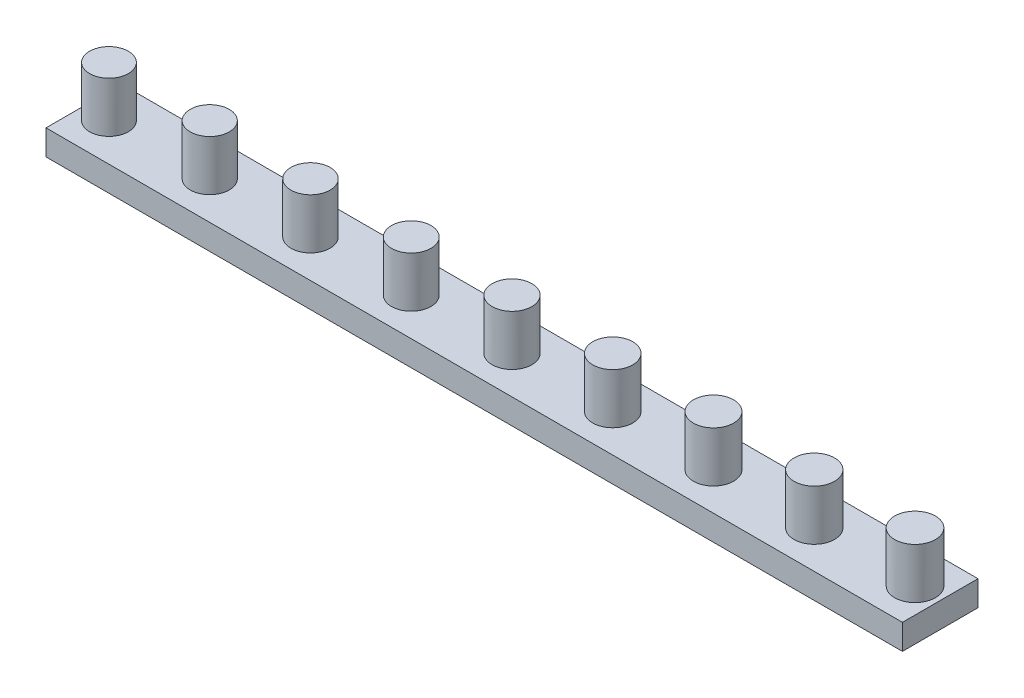
ISO-10303-21;
HEADER;
FILE_DESCRIPTION(('STEP AP214'),'2;1');
FILE_NAME('part.step','',(''),(''),'','','');
FILE_SCHEMA(('AUTOMOTIVE_DESIGN { 1 0 10303 214 1 1 1 1 }'));
ENDSEC;
DATA;
#1=APPLICATION_CONTEXT('core data for automotive mechanical design processes');
#2=APPLICATION_PROTOCOL_DEFINITION('international standard','automotive_design',2000,#1);
#3=PRODUCT_CONTEXT('',#1,'mechanical');
#4=PRODUCT('Part','Part','',(#3));
#5=PRODUCT_RELATED_PRODUCT_CATEGORY('part','',(#4));
#6=PRODUCT_DEFINITION_FORMATION('','',#4);
#7=PRODUCT_DEFINITION_CONTEXT('part definition',#1,'design');
#8=PRODUCT_DEFINITION('design','',#6,#7);
#9=PRODUCT_DEFINITION_SHAPE('','',#8);
#10=(LENGTH_UNIT() NAMED_UNIT(*) SI_UNIT(.MILLI.,.METRE.));
#11=(NAMED_UNIT(*) PLANE_ANGLE_UNIT() SI_UNIT($,.RADIAN.));
#12=(NAMED_UNIT(*) SI_UNIT($,.STERADIAN.) SOLID_ANGLE_UNIT());
#13=UNCERTAINTY_MEASURE_WITH_UNIT(LENGTH_MEASURE(1.E-05),#10,'distance_accuracy_value','');
#14=(GEOMETRIC_REPRESENTATION_CONTEXT(3) GLOBAL_UNCERTAINTY_ASSIGNED_CONTEXT((#13)) GLOBAL_UNIT_ASSIGNED_CONTEXT((#10,
#11,#12)) REPRESENTATION_CONTEXT('',''));
#15=CARTESIAN_POINT('',(0.,0.,0.));
#16=DIRECTION('',(0.,0.,1.));
#17=DIRECTION('',(1.,0.,0.));
#18=AXIS2_PLACEMENT_3D('',#15,#16,#17);
#19=CARTESIAN_POINT('',(85.,5.,7.5));
#20=DIRECTION('',(-1.,0.,0.));
#21=DIRECTION('',(0.,0.,1.));
#22=AXIS2_PLACEMENT_3D('',#19,#20,#21);
#23=PLANE('',#22);
#24=DIRECTION('',(0.,0.,-1.));
#25=VECTOR('',#24,1.);
#26=CARTESIAN_POINT('',(85.,0.,7.5));
#27=LINE('',#26,#25);
#28=CARTESIAN_POINT('',(85.,0.,7.5));
#29=VERTEX_POINT('',#28);
#30=CARTESIAN_POINT('',(85.,0.,-7.5));
#31=VERTEX_POINT('',#30);
#32=EDGE_CURVE('E100',#29,#31,#27,.T.);
#33=ORIENTED_EDGE('',*,*,#32,.T.);
#34=DIRECTION('',(0.,-1.,0.));
#35=VECTOR('',#34,1.);
#36=CARTESIAN_POINT('',(85.,5.,-7.5));
#37=LINE('',#36,#35);
#38=CARTESIAN_POINT('',(85.,5.,-7.5));
#39=VERTEX_POINT('',#38);
#40=EDGE_CURVE('E91',#39,#31,#37,.T.);
#41=ORIENTED_EDGE('',*,*,#40,.F.);
#42=DIRECTION('',(0.,0.,-1.));
#43=VECTOR('',#42,1.);
#44=CARTESIAN_POINT('',(85.,5.,7.5));
#45=LINE('',#44,#43);
#46=CARTESIAN_POINT('',(85.,5.,7.5));
#47=VERTEX_POINT('',#46);
#48=EDGE_CURVE('E85',#47,#39,#45,.T.);
#49=ORIENTED_EDGE('',*,*,#48,.F.);
#50=DIRECTION('',(0.,-1.,0.));
#51=VECTOR('',#50,1.);
#52=CARTESIAN_POINT('',(85.,5.,7.5));
#53=LINE('',#52,#51);
#54=EDGE_CURVE('E96',#47,#29,#53,.T.);
#55=ORIENTED_EDGE('',*,*,#54,.T.);
#56=EDGE_LOOP('',(#33,#41,#49,#55));
#57=FACE_BOUND('',#56,.T.);
#58=ADVANCED_FACE('F33',(#57),#23,.F.);
#59=CARTESIAN_POINT('',(-85.,5.,-7.5));
#60=DIRECTION('',(0.,0.,1.));
#61=DIRECTION('',(1.,0.,0.));
#62=AXIS2_PLACEMENT_3D('',#59,#60,#61);
#63=PLANE('',#62);
#64=DIRECTION('',(-1.,0.,0.));
#65=VECTOR('',#64,1.);
#66=CARTESIAN_POINT('',(-85.,0.,-7.5));
#67=LINE('',#66,#65);
#68=CARTESIAN_POINT('',(-85.,0.,-7.5));
#69=VERTEX_POINT('',#68);
#70=EDGE_CURVE('E90',#31,#69,#67,.T.);
#71=ORIENTED_EDGE('',*,*,#70,.T.);
#72=DIRECTION('',(0.,-1.,0.));
#73=VECTOR('',#72,1.);
#74=CARTESIAN_POINT('',(-85.,5.,-7.5));
#75=LINE('',#74,#73);
#76=CARTESIAN_POINT('',(-85.,5.,-7.5));
#77=VERTEX_POINT('',#76);
#78=EDGE_CURVE('E88',#77,#69,#75,.T.);
#79=ORIENTED_EDGE('',*,*,#78,.F.);
#80=DIRECTION('',(-1.,0.,0.));
#81=VECTOR('',#80,1.);
#82=CARTESIAN_POINT('',(-85.,5.,-7.5));
#83=LINE('',#82,#81);
#84=EDGE_CURVE('E80',#39,#77,#83,.T.);
#85=ORIENTED_EDGE('',*,*,#84,.F.);
#86=ORIENTED_EDGE('',*,*,#40,.T.);
#87=EDGE_LOOP('',(#71,#79,#85,#86));
#88=FACE_BOUND('',#87,.T.);
#89=ADVANCED_FACE('F89',(#88),#63,.F.);
#90=CARTESIAN_POINT('',(-85.,5.,7.5));
#91=DIRECTION('',(1.,0.,0.));
#92=DIRECTION('',(0.,0.,-1.));
#93=AXIS2_PLACEMENT_3D('',#90,#91,#92);
#94=PLANE('',#93);
#95=DIRECTION('',(0.,0.,1.));
#96=VECTOR('',#95,1.);
#97=CARTESIAN_POINT('',(-85.,0.,7.5));
#98=LINE('',#97,#96);
#99=CARTESIAN_POINT('',(-85.,0.,7.5));
#100=VERTEX_POINT('',#99);
#101=EDGE_CURVE('E66',#69,#100,#98,.T.);
#102=ORIENTED_EDGE('',*,*,#101,.T.);
#103=DIRECTION('',(0.,-1.,0.));
#104=VECTOR('',#103,1.);
#105=CARTESIAN_POINT('',(-85.,5.,7.5));
#106=LINE('',#105,#104);
#107=CARTESIAN_POINT('',(-85.,5.,7.5));
#108=VERTEX_POINT('',#107);
#109=EDGE_CURVE('E92',#108,#100,#106,.T.);
#110=ORIENTED_EDGE('',*,*,#109,.F.);
#111=DIRECTION('',(0.,0.,1.));
#112=VECTOR('',#111,1.);
#113=CARTESIAN_POINT('',(-85.,5.,7.5));
#114=LINE('',#113,#112);
#115=EDGE_CURVE('E83',#77,#108,#114,.T.);
#116=ORIENTED_EDGE('',*,*,#115,.F.);
#117=ORIENTED_EDGE('',*,*,#78,.T.);
#118=EDGE_LOOP('',(#102,#110,#116,#117));
#119=FACE_BOUND('',#118,.T.);
#120=ADVANCED_FACE('F94',(#119),#94,.F.);
#121=CARTESIAN_POINT('',(-85.,5.,7.5));
#122=DIRECTION('',(0.,0.,-1.));
#123=DIRECTION('',(-1.,0.,0.));
#124=AXIS2_PLACEMENT_3D('',#121,#122,#123);
#125=PLANE('',#124);
#126=DIRECTION('',(1.,0.,0.));
#127=VECTOR('',#126,1.);
#128=CARTESIAN_POINT('',(-85.,0.,7.5));
#129=LINE('',#128,#127);
#130=EDGE_CURVE('E72',#100,#29,#129,.T.);
#131=ORIENTED_EDGE('',*,*,#130,.T.);
#132=ORIENTED_EDGE('',*,*,#54,.F.);
#133=DIRECTION('',(1.,0.,0.));
#134=VECTOR('',#133,1.);
#135=CARTESIAN_POINT('',(-85.,5.,7.5));
#136=LINE('',#135,#134);
#137=EDGE_CURVE('E49',#108,#47,#136,.T.);
#138=ORIENTED_EDGE('',*,*,#137,.F.);
#139=ORIENTED_EDGE('',*,*,#109,.T.);
#140=EDGE_LOOP('',(#131,#132,#138,#139));
#141=FACE_BOUND('',#140,.T.);
#142=ADVANCED_FACE('F138',(#141),#125,.F.);
#143=CARTESIAN_POINT('',(0.,5.,0.));
#144=DIRECTION('',(0.,-1.,0.));
#145=DIRECTION('',(0.,0.,-1.));
#146=AXIS2_PLACEMENT_3D('',#143,#144,#145);
#147=PLANE('',#146);
#148=CARTESIAN_POINT('',(80.,5.,0.));
#149=DIRECTION('',(0.,-1.,0.));
#150=DIRECTION('',(0.,0.,-1.));
#151=AXIS2_PLACEMENT_3D('',#148,#149,#150);
#152=CIRCLE('',#151,4.05);
#153=CARTESIAN_POINT('',(80.,5.,-4.05));
#154=VERTEX_POINT('',#153);
#155=EDGE_CURVE('E11',#154,#154,#152,.F.);
#156=ORIENTED_EDGE('',*,*,#155,.F.);
#157=EDGE_LOOP('',(#156));
#158=FACE_BOUND('',#157,.T.);
#159=CARTESIAN_POINT('',(60.,5.,0.));
#160=DIRECTION('',(0.,-1.,0.));
#161=DIRECTION('',(0.,0.,-1.));
#162=AXIS2_PLACEMENT_3D('',#159,#160,#161);
#163=CIRCLE('',#162,4.025);
#164=CARTESIAN_POINT('',(60.,5.,-4.025));
#165=VERTEX_POINT('',#164);
#166=EDGE_CURVE('E41',#165,#165,#163,.F.);
#167=ORIENTED_EDGE('',*,*,#166,.F.);
#168=EDGE_LOOP('',(#167));
#169=FACE_BOUND('',#168,.T.);
#170=CARTESIAN_POINT('',(40.,5.,0.));
#171=DIRECTION('',(0.,-1.,0.));
#172=DIRECTION('',(0.,0.,-1.));
#173=AXIS2_PLACEMENT_3D('',#170,#171,#172);
#174=CIRCLE('',#173,4.);
#175=CARTESIAN_POINT('',(40.,5.,-4.));
#176=VERTEX_POINT('',#175);
#177=EDGE_CURVE('E128',#176,#176,#174,.F.);
#178=ORIENTED_EDGE('',*,*,#177,.F.);
#179=EDGE_LOOP('',(#178));
#180=FACE_BOUND('',#179,.T.);
#181=CARTESIAN_POINT('',(20.,5.,0.));
#182=DIRECTION('',(0.,-1.,0.));
#183=DIRECTION('',(0.,0.,-1.));
#184=AXIS2_PLACEMENT_3D('',#181,#182,#183);
#185=CIRCLE('',#184,3.975);
#186=CARTESIAN_POINT('',(20.,5.,-3.975));
#187=VERTEX_POINT('',#186);
#188=EDGE_CURVE('E125',#187,#187,#185,.F.);
#189=ORIENTED_EDGE('',*,*,#188,.F.);
#190=EDGE_LOOP('',(#189));
#191=FACE_BOUND('',#190,.T.);
#192=CARTESIAN_POINT('',(0.,5.,0.));
#193=DIRECTION('',(0.,-1.,0.));
#194=DIRECTION('',(0.,0.,-1.));
#195=AXIS2_PLACEMENT_3D('',#192,#193,#194);
#196=CIRCLE('',#195,3.95);
#197=CARTESIAN_POINT('',(0.,5.,-3.95));
#198=VERTEX_POINT('',#197);
#199=EDGE_CURVE('E122',#198,#198,#196,.F.);
#200=ORIENTED_EDGE('',*,*,#199,.F.);
#201=EDGE_LOOP('',(#200));
#202=FACE_BOUND('',#201,.T.);
#203=CARTESIAN_POINT('',(-20.,5.,0.));
#204=DIRECTION('',(0.,-1.,0.));
#205=DIRECTION('',(0.,0.,-1.));
#206=AXIS2_PLACEMENT_3D('',#203,#204,#205);
#207=CIRCLE('',#206,3.92499999999999);
#208=CARTESIAN_POINT('',(-20.,5.,-3.92499999999999));
#209=VERTEX_POINT('',#208);
#210=EDGE_CURVE('E119',#209,#209,#207,.F.);
#211=ORIENTED_EDGE('',*,*,#210,.F.);
#212=EDGE_LOOP('',(#211));
#213=FACE_BOUND('',#212,.T.);
#214=CARTESIAN_POINT('',(-40.,5.,0.));
#215=DIRECTION('',(0.,-1.,0.));
#216=DIRECTION('',(0.,0.,-1.));
#217=AXIS2_PLACEMENT_3D('',#214,#215,#216);
#218=CIRCLE('',#217,3.9);
#219=CARTESIAN_POINT('',(-40.,5.,-3.9));
#220=VERTEX_POINT('',#219);
#221=EDGE_CURVE('E116',#220,#220,#218,.F.);
#222=ORIENTED_EDGE('',*,*,#221,.F.);
#223=EDGE_LOOP('',(#222));
#224=FACE_BOUND('',#223,.T.);
#225=CARTESIAN_POINT('',(-60.,5.,0.));
#226=DIRECTION('',(0.,-1.,0.));
#227=DIRECTION('',(0.,0.,-1.));
#228=AXIS2_PLACEMENT_3D('',#225,#226,#227);
#229=CIRCLE('',#228,3.875);
#230=CARTESIAN_POINT('',(-60.,5.,-3.875));
#231=VERTEX_POINT('',#230);
#232=EDGE_CURVE('E113',#231,#231,#229,.F.);
#233=ORIENTED_EDGE('',*,*,#232,.F.);
#234=EDGE_LOOP('',(#233));
#235=FACE_BOUND('',#234,.T.);
#236=CARTESIAN_POINT('',(-80.,5.,0.));
#237=DIRECTION('',(0.,-1.,0.));
#238=DIRECTION('',(0.,0.,-1.));
#239=AXIS2_PLACEMENT_3D('',#236,#237,#238);
#240=CIRCLE('',#239,3.85);
#241=CARTESIAN_POINT('',(-80.,5.,-3.85));
#242=VERTEX_POINT('',#241);
#243=EDGE_CURVE('E110',#242,#242,#240,.F.);
#244=ORIENTED_EDGE('',*,*,#243,.F.);
#245=EDGE_LOOP('',(#244));
#246=FACE_BOUND('',#245,.T.);
#247=ORIENTED_EDGE('',*,*,#48,.T.);
#248=ORIENTED_EDGE('',*,*,#84,.T.);
#249=ORIENTED_EDGE('',*,*,#115,.T.);
#250=ORIENTED_EDGE('',*,*,#137,.T.);
#251=EDGE_LOOP('',(#247,#248,#249,#250));
#252=FACE_BOUND('',#251,.T.);
#253=ADVANCED_FACE('F81',(#158,#169,#180,#191,#202,#213,#224,#235,#246,#252),#147,.F.);
#254=CARTESIAN_POINT('',(0.,0.,0.));
#255=DIRECTION('',(0.,-1.,0.));
#256=DIRECTION('',(0.,0.,-1.));
#257=AXIS2_PLACEMENT_3D('',#254,#255,#256);
#258=PLANE('',#257);
#259=ORIENTED_EDGE('',*,*,#32,.F.);
#260=ORIENTED_EDGE('',*,*,#130,.F.);
#261=ORIENTED_EDGE('',*,*,#101,.F.);
#262=ORIENTED_EDGE('',*,*,#70,.F.);
#263=EDGE_LOOP('',(#259,#260,#261,#262));
#264=FACE_BOUND('',#263,.T.);
#265=ADVANCED_FACE('F137',(#264),#258,.T.);
#266=CARTESIAN_POINT('',(-80.,15.,0.));
#267=DIRECTION('',(0.,-1.,0.));
#268=DIRECTION('',(0.,0.,-1.));
#269=AXIS2_PLACEMENT_3D('',#266,#267,#268);
#270=CYLINDRICAL_SURFACE('',#269,3.85);
#271=CARTESIAN_POINT('',(-80.,15.,0.));
#272=DIRECTION('',(0.,1.,0.));
#273=DIRECTION('',(0.,0.,1.));
#274=AXIS2_PLACEMENT_3D('',#271,#272,#273);
#275=CIRCLE('',#274,3.85);
#276=CARTESIAN_POINT('',(-80.,15.,3.85));
#277=VERTEX_POINT('',#276);
#278=EDGE_CURVE('E103',#277,#277,#275,.T.);
#279=ORIENTED_EDGE('',*,*,#278,.F.);
#280=EDGE_LOOP('',(#279));
#281=FACE_BOUND('',#280,.T.);
#282=ORIENTED_EDGE('',*,*,#243,.T.);
#283=EDGE_LOOP('',(#282));
#284=FACE_BOUND('',#283,.T.);
#285=ADVANCED_FACE('F155',(#281,#284),#270,.T.);
#286=CARTESIAN_POINT('',(-80.,15.,0.));
#287=DIRECTION('',(0.,1.,0.));
#288=DIRECTION('',(0.,0.,1.));
#289=AXIS2_PLACEMENT_3D('',#286,#287,#288);
#290=PLANE('',#289);
#291=ORIENTED_EDGE('',*,*,#278,.T.);
#292=EDGE_LOOP('',(#291));
#293=FACE_BOUND('',#292,.T.);
#294=ADVANCED_FACE('F157',(#293),#290,.T.);
#295=CARTESIAN_POINT('',(-60.,15.,0.));
#296=DIRECTION('',(0.,-1.,0.));
#297=DIRECTION('',(0.,0.,-1.));
#298=AXIS2_PLACEMENT_3D('',#295,#296,#297);
#299=CYLINDRICAL_SURFACE('',#298,3.875);
#300=CARTESIAN_POINT('',(-60.,15.,0.));
#301=DIRECTION('',(0.,1.,0.));
#302=DIRECTION('',(0.,0.,1.));
#303=AXIS2_PLACEMENT_3D('',#300,#301,#302);
#304=CIRCLE('',#303,3.875);
#305=CARTESIAN_POINT('',(-60.,15.,3.875));
#306=VERTEX_POINT('',#305);
#307=EDGE_CURVE('E403',#306,#306,#304,.T.);
#308=ORIENTED_EDGE('',*,*,#307,.F.);
#309=EDGE_LOOP('',(#308));
#310=FACE_BOUND('',#309,.T.);
#311=ORIENTED_EDGE('',*,*,#232,.T.);
#312=EDGE_LOOP('',(#311));
#313=FACE_BOUND('',#312,.T.);
#314=ADVANCED_FACE('F164',(#310,#313),#299,.T.);
#315=CARTESIAN_POINT('',(-60.,15.,0.));
#316=DIRECTION('',(0.,1.,0.));
#317=DIRECTION('',(0.,0.,1.));
#318=AXIS2_PLACEMENT_3D('',#315,#316,#317);
#319=PLANE('',#318);
#320=ORIENTED_EDGE('',*,*,#307,.T.);
#321=EDGE_LOOP('',(#320));
#322=FACE_BOUND('',#321,.T.);
#323=ADVANCED_FACE('F227',(#322),#319,.T.);
#324=CARTESIAN_POINT('',(-40.,15.,0.));
#325=DIRECTION('',(0.,-1.,0.));
#326=DIRECTION('',(0.,0.,-1.));
#327=AXIS2_PLACEMENT_3D('',#324,#325,#326);
#328=CYLINDRICAL_SURFACE('',#327,3.9);
#329=CARTESIAN_POINT('',(-40.,15.,0.));
#330=DIRECTION('',(0.,1.,0.));
#331=DIRECTION('',(0.,0.,1.));
#332=AXIS2_PLACEMENT_3D('',#329,#330,#331);
#333=CIRCLE('',#332,3.9);
#334=CARTESIAN_POINT('',(-40.,15.,3.9));
#335=VERTEX_POINT('',#334);
#336=EDGE_CURVE('E400',#335,#335,#333,.T.);
#337=ORIENTED_EDGE('',*,*,#336,.F.);
#338=EDGE_LOOP('',(#337));
#339=FACE_BOUND('',#338,.T.);
#340=ORIENTED_EDGE('',*,*,#221,.T.);
#341=EDGE_LOOP('',(#340));
#342=FACE_BOUND('',#341,.T.);
#343=ADVANCED_FACE('F236',(#339,#342),#328,.T.);
#344=CARTESIAN_POINT('',(-40.,15.,0.));
#345=DIRECTION('',(0.,1.,0.));
#346=DIRECTION('',(0.,0.,1.));
#347=AXIS2_PLACEMENT_3D('',#344,#345,#346);
#348=PLANE('',#347);
#349=ORIENTED_EDGE('',*,*,#336,.T.);
#350=EDGE_LOOP('',(#349));
#351=FACE_BOUND('',#350,.T.);
#352=ADVANCED_FACE('F245',(#351),#348,.T.);
#353=CARTESIAN_POINT('',(-20.,15.,0.));
#354=DIRECTION('',(0.,-1.,0.));
#355=DIRECTION('',(0.,0.,-1.));
#356=AXIS2_PLACEMENT_3D('',#353,#354,#355);
#357=CYLINDRICAL_SURFACE('',#356,3.92499999999999);
#358=CARTESIAN_POINT('',(-20.,15.,0.));
#359=DIRECTION('',(0.,1.,0.));
#360=DIRECTION('',(0.,0.,1.));
#361=AXIS2_PLACEMENT_3D('',#358,#359,#360);
#362=CIRCLE('',#361,3.92499999999999);
#363=CARTESIAN_POINT('',(-20.,15.,3.92499999999999));
#364=VERTEX_POINT('',#363);
#365=EDGE_CURVE('E397',#364,#364,#362,.T.);
#366=ORIENTED_EDGE('',*,*,#365,.F.);
#367=EDGE_LOOP('',(#366));
#368=FACE_BOUND('',#367,.T.);
#369=ORIENTED_EDGE('',*,*,#210,.T.);
#370=EDGE_LOOP('',(#369));
#371=FACE_BOUND('',#370,.T.);
#372=ADVANCED_FACE('F254',(#368,#371),#357,.T.);
#373=CARTESIAN_POINT('',(-20.,15.,0.));
#374=DIRECTION('',(0.,1.,0.));
#375=DIRECTION('',(0.,0.,1.));
#376=AXIS2_PLACEMENT_3D('',#373,#374,#375);
#377=PLANE('',#376);
#378=ORIENTED_EDGE('',*,*,#365,.T.);
#379=EDGE_LOOP('',(#378));
#380=FACE_BOUND('',#379,.T.);
#381=ADVANCED_FACE('F263',(#380),#377,.T.);
#382=CARTESIAN_POINT('',(0.,15.,0.));
#383=DIRECTION('',(0.,-1.,0.));
#384=DIRECTION('',(0.,0.,-1.));
#385=AXIS2_PLACEMENT_3D('',#382,#383,#384);
#386=CYLINDRICAL_SURFACE('',#385,3.95);
#387=CARTESIAN_POINT('',(0.,15.,0.));
#388=DIRECTION('',(0.,1.,0.));
#389=DIRECTION('',(0.,0.,1.));
#390=AXIS2_PLACEMENT_3D('',#387,#388,#389);
#391=CIRCLE('',#390,3.95);
#392=CARTESIAN_POINT('',(0.,15.,3.95));
#393=VERTEX_POINT('',#392);
#394=EDGE_CURVE('E394',#393,#393,#391,.T.);
#395=ORIENTED_EDGE('',*,*,#394,.F.);
#396=EDGE_LOOP('',(#395));
#397=FACE_BOUND('',#396,.T.);
#398=ORIENTED_EDGE('',*,*,#199,.T.);
#399=EDGE_LOOP('',(#398));
#400=FACE_BOUND('',#399,.T.);
#401=ADVANCED_FACE('F272',(#397,#400),#386,.T.);
#402=CARTESIAN_POINT('',(0.,15.,0.));
#403=DIRECTION('',(0.,1.,0.));
#404=DIRECTION('',(0.,0.,1.));
#405=AXIS2_PLACEMENT_3D('',#402,#403,#404);
#406=PLANE('',#405);
#407=ORIENTED_EDGE('',*,*,#394,.T.);
#408=EDGE_LOOP('',(#407));
#409=FACE_BOUND('',#408,.T.);
#410=ADVANCED_FACE('F281',(#409),#406,.T.);
#411=CARTESIAN_POINT('',(20.,15.,0.));
#412=DIRECTION('',(0.,-1.,0.));
#413=DIRECTION('',(0.,0.,-1.));
#414=AXIS2_PLACEMENT_3D('',#411,#412,#413);
#415=CYLINDRICAL_SURFACE('',#414,3.975);
#416=CARTESIAN_POINT('',(20.,15.,0.));
#417=DIRECTION('',(0.,1.,0.));
#418=DIRECTION('',(0.,0.,1.));
#419=AXIS2_PLACEMENT_3D('',#416,#417,#418);
#420=CIRCLE('',#419,3.975);
#421=CARTESIAN_POINT('',(20.,15.,3.975));
#422=VERTEX_POINT('',#421);
#423=EDGE_CURVE('E391',#422,#422,#420,.T.);
#424=ORIENTED_EDGE('',*,*,#423,.F.);
#425=EDGE_LOOP('',(#424));
#426=FACE_BOUND('',#425,.T.);
#427=ORIENTED_EDGE('',*,*,#188,.T.);
#428=EDGE_LOOP('',(#427));
#429=FACE_BOUND('',#428,.T.);
#430=ADVANCED_FACE('F290',(#426,#429),#415,.T.);
#431=CARTESIAN_POINT('',(20.,15.,0.));
#432=DIRECTION('',(0.,1.,0.));
#433=DIRECTION('',(0.,0.,1.));
#434=AXIS2_PLACEMENT_3D('',#431,#432,#433);
#435=PLANE('',#434);
#436=ORIENTED_EDGE('',*,*,#423,.T.);
#437=EDGE_LOOP('',(#436));
#438=FACE_BOUND('',#437,.T.);
#439=ADVANCED_FACE('F299',(#438),#435,.T.);
#440=CARTESIAN_POINT('',(40.,15.,0.));
#441=DIRECTION('',(0.,-1.,0.));
#442=DIRECTION('',(0.,0.,-1.));
#443=AXIS2_PLACEMENT_3D('',#440,#441,#442);
#444=CYLINDRICAL_SURFACE('',#443,4.);
#445=CARTESIAN_POINT('',(40.,15.,0.));
#446=DIRECTION('',(0.,1.,0.));
#447=DIRECTION('',(0.,0.,1.));
#448=AXIS2_PLACEMENT_3D('',#445,#446,#447);
#449=CIRCLE('',#448,4.);
#450=CARTESIAN_POINT('',(40.,15.,4.));
#451=VERTEX_POINT('',#450);
#452=EDGE_CURVE('E386',#451,#451,#449,.T.);
#453=ORIENTED_EDGE('',*,*,#452,.F.);
#454=EDGE_LOOP('',(#453));
#455=FACE_BOUND('',#454,.T.);
#456=ORIENTED_EDGE('',*,*,#177,.T.);
#457=EDGE_LOOP('',(#456));
#458=FACE_BOUND('',#457,.T.);
#459=ADVANCED_FACE('F308',(#455,#458),#444,.T.);
#460=CARTESIAN_POINT('',(40.,15.,0.));
#461=DIRECTION('',(0.,1.,0.));
#462=DIRECTION('',(0.,0.,1.));
#463=AXIS2_PLACEMENT_3D('',#460,#461,#462);
#464=PLANE('',#463);
#465=ORIENTED_EDGE('',*,*,#452,.T.);
#466=EDGE_LOOP('',(#465));
#467=FACE_BOUND('',#466,.T.);
#468=ADVANCED_FACE('F317',(#467),#464,.T.);
#469=CARTESIAN_POINT('',(60.,15.,0.));
#470=DIRECTION('',(0.,-1.,0.));
#471=DIRECTION('',(0.,0.,-1.));
#472=AXIS2_PLACEMENT_3D('',#469,#470,#471);
#473=CYLINDRICAL_SURFACE('',#472,4.025);
#474=CARTESIAN_POINT('',(60.,15.,0.));
#475=DIRECTION('',(0.,1.,0.));
#476=DIRECTION('',(0.,0.,1.));
#477=AXIS2_PLACEMENT_3D('',#474,#475,#476);
#478=CIRCLE('',#477,4.025);
#479=CARTESIAN_POINT('',(60.,15.,4.025));
#480=VERTEX_POINT('',#479);
#481=EDGE_CURVE('E383',#480,#480,#478,.T.);
#482=ORIENTED_EDGE('',*,*,#481,.F.);
#483=EDGE_LOOP('',(#482));
#484=FACE_BOUND('',#483,.T.);
#485=ORIENTED_EDGE('',*,*,#166,.T.);
#486=EDGE_LOOP('',(#485));
#487=FACE_BOUND('',#486,.T.);
#488=ADVANCED_FACE('F133',(#484,#487),#473,.T.);
#489=CARTESIAN_POINT('',(60.,15.,0.));
#490=DIRECTION('',(0.,1.,0.));
#491=DIRECTION('',(0.,0.,1.));
#492=AXIS2_PLACEMENT_3D('',#489,#490,#491);
#493=PLANE('',#492);
#494=ORIENTED_EDGE('',*,*,#481,.T.);
#495=EDGE_LOOP('',(#494));
#496=FACE_BOUND('',#495,.T.);
#497=ADVANCED_FACE('F334',(#496),#493,.T.);
#498=CARTESIAN_POINT('',(80.,15.,0.));
#499=DIRECTION('',(0.,-1.,0.));
#500=DIRECTION('',(0.,0.,-1.));
#501=AXIS2_PLACEMENT_3D('',#498,#499,#500);
#502=CYLINDRICAL_SURFACE('',#501,4.05);
#503=CARTESIAN_POINT('',(80.,15.,0.));
#504=DIRECTION('',(0.,1.,0.));
#505=DIRECTION('',(0.,0.,1.));
#506=AXIS2_PLACEMENT_3D('',#503,#504,#505);
#507=CIRCLE('',#506,4.05);
#508=CARTESIAN_POINT('',(80.,15.,4.05));
#509=VERTEX_POINT('',#508);
#510=EDGE_CURVE('E382',#509,#509,#507,.T.);
#511=ORIENTED_EDGE('',*,*,#510,.F.);
#512=EDGE_LOOP('',(#511));
#513=FACE_BOUND('',#512,.T.);
#514=ORIENTED_EDGE('',*,*,#155,.T.);
#515=EDGE_LOOP('',(#514));
#516=FACE_BOUND('',#515,.T.);
#517=ADVANCED_FACE('F343',(#513,#516),#502,.T.);
#518=CARTESIAN_POINT('',(80.,15.,0.));
#519=DIRECTION('',(0.,1.,0.));
#520=DIRECTION('',(0.,0.,1.));
#521=AXIS2_PLACEMENT_3D('',#518,#519,#520);
#522=PLANE('',#521);
#523=ORIENTED_EDGE('',*,*,#510,.T.);
#524=EDGE_LOOP('',(#523));
#525=FACE_BOUND('',#524,.T.);
#526=ADVANCED_FACE('F352',(#525),#522,.T.);
#527=CLOSED_SHELL('',(#58,#89,#120,#142,#253,#265,#285,#294,#314,#323,#343,#352,#372,#381,#401,
#410,#430,#439,#459,#468,#488,#497,#517,#526));
#528=MANIFOLD_SOLID_BREP('B2',#527);
#529=ADVANCED_BREP_SHAPE_REPRESENTATION('',(#18,#528),#14);
#530=SHAPE_DEFINITION_REPRESENTATION(#9,#529);
ENDSEC;
END-ISO-10303-21;
